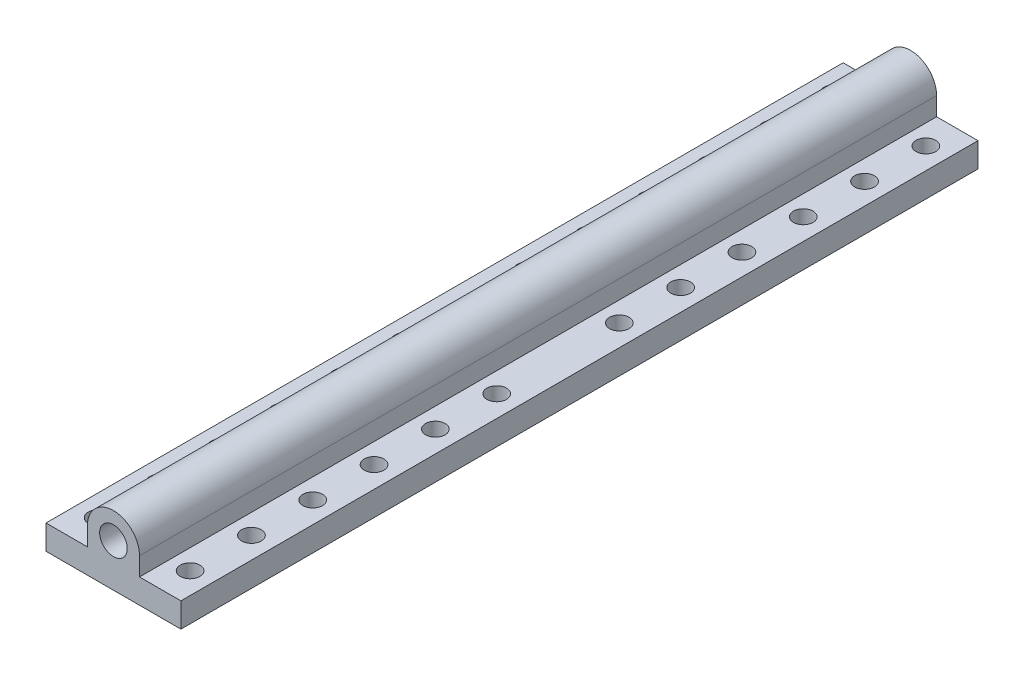
ISO-10303-21;
HEADER;
FILE_DESCRIPTION(('STEP AP214'),'2;1');
FILE_NAME('part.step','',(''),(''),'','','');
FILE_SCHEMA(('AUTOMOTIVE_DESIGN { 1 0 10303 214 1 1 1 1 }'));
ENDSEC;
DATA;
#1=APPLICATION_CONTEXT('core data for automotive mechanical design processes');
#2=APPLICATION_PROTOCOL_DEFINITION('international standard','automotive_design',2000,#1);
#3=PRODUCT_CONTEXT('',#1,'mechanical');
#4=PRODUCT('Part','Part','',(#3));
#5=PRODUCT_RELATED_PRODUCT_CATEGORY('part','',(#4));
#6=PRODUCT_DEFINITION_FORMATION('','',#4);
#7=PRODUCT_DEFINITION_CONTEXT('part definition',#1,'design');
#8=PRODUCT_DEFINITION('design','',#6,#7);
#9=PRODUCT_DEFINITION_SHAPE('','',#8);
#10=(LENGTH_UNIT() NAMED_UNIT(*) SI_UNIT(.MILLI.,.METRE.));
#11=(NAMED_UNIT(*) PLANE_ANGLE_UNIT() SI_UNIT($,.RADIAN.));
#12=(NAMED_UNIT(*) SI_UNIT($,.STERADIAN.) SOLID_ANGLE_UNIT());
#13=UNCERTAINTY_MEASURE_WITH_UNIT(LENGTH_MEASURE(1.E-05),#10,'distance_accuracy_value','');
#14=(GEOMETRIC_REPRESENTATION_CONTEXT(3) GLOBAL_UNCERTAINTY_ASSIGNED_CONTEXT((#13)) GLOBAL_UNIT_ASSIGNED_CONTEXT((#10,
#11,#12)) REPRESENTATION_CONTEXT('',''));
#15=CARTESIAN_POINT('',(0.,0.,0.));
#16=DIRECTION('',(0.,0.,1.));
#17=DIRECTION('',(1.,0.,0.));
#18=AXIS2_PLACEMENT_3D('',#15,#16,#17);
#19=CARTESIAN_POINT('',(1.27227011494252,7.,130.));
#20=DIRECTION('',(0.,0.,1.));
#21=DIRECTION('',(1.,0.,0.));
#22=AXIS2_PLACEMENT_3D('',#19,#20,#21);
#23=PLANE('',#22);
#24=DIRECTION('',(0.,-1.,0.));
#25=VECTOR('',#24,1.);
#26=CARTESIAN_POINT('',(-9.72772988505748,4.,130.));
#27=LINE('',#26,#25);
#28=CARTESIAN_POINT('',(-9.72772988505748,4.,130.));
#29=VERTEX_POINT('',#28);
#30=CARTESIAN_POINT('',(-9.72772988505748,0.,130.));
#31=VERTEX_POINT('',#30);
#32=EDGE_CURVE('E166',#29,#31,#27,.T.);
#33=ORIENTED_EDGE('',*,*,#32,.T.);
#34=DIRECTION('',(1.,0.,0.));
#35=VECTOR('',#34,1.);
#36=CARTESIAN_POINT('',(-9.72772988505748,0.,130.));
#37=LINE('',#36,#35);
#38=CARTESIAN_POINT('',(12.2722701149425,0.,130.));
#39=VERTEX_POINT('',#38);
#40=EDGE_CURVE('E102',#31,#39,#37,.T.);
#41=ORIENTED_EDGE('',*,*,#40,.T.);
#42=DIRECTION('',(0.,1.,0.));
#43=VECTOR('',#42,1.);
#44=CARTESIAN_POINT('',(12.2722701149425,0.,130.));
#45=LINE('',#44,#43);
#46=CARTESIAN_POINT('',(12.2722701149425,4.,130.));
#47=VERTEX_POINT('',#46);
#48=EDGE_CURVE('E325',#39,#47,#45,.T.);
#49=ORIENTED_EDGE('',*,*,#48,.T.);
#50=DIRECTION('',(-1.,0.,0.));
#51=VECTOR('',#50,1.);
#52=CARTESIAN_POINT('',(12.2722701149425,4.,130.));
#53=LINE('',#52,#51);
#54=CARTESIAN_POINT('',(5.52227011494252,4.,130.));
#55=VERTEX_POINT('',#54);
#56=EDGE_CURVE('E328',#47,#55,#53,.T.);
#57=ORIENTED_EDGE('',*,*,#56,.T.);
#58=DIRECTION('',(0.,1.,0.));
#59=VECTOR('',#58,1.);
#60=CARTESIAN_POINT('',(5.52227011494252,7.,130.));
#61=LINE('',#60,#59);
#62=CARTESIAN_POINT('',(5.52227011494252,7.,130.));
#63=VERTEX_POINT('',#62);
#64=EDGE_CURVE('E121',#55,#63,#61,.T.);
#65=ORIENTED_EDGE('',*,*,#64,.T.);
#66=CARTESIAN_POINT('',(1.27227011494252,7.,130.));
#67=DIRECTION('',(0.,0.,1.));
#68=DIRECTION('',(1.,0.,0.));
#69=AXIS2_PLACEMENT_3D('',#66,#67,#68);
#70=CIRCLE('',#69,4.25);
#71=CARTESIAN_POINT('',(-2.97772988505748,6.99999999999997,130.));
#72=VERTEX_POINT('',#71);
#73=EDGE_CURVE('E115',#63,#72,#70,.T.);
#74=ORIENTED_EDGE('',*,*,#73,.T.);
#75=DIRECTION('',(0.,-1.,0.));
#76=VECTOR('',#75,1.);
#77=CARTESIAN_POINT('',(-2.97772988505748,6.99999999999997,130.));
#78=LINE('',#77,#76);
#79=CARTESIAN_POINT('',(-2.97772988505748,4.,130.));
#80=VERTEX_POINT('',#79);
#81=EDGE_CURVE('E119',#72,#80,#78,.T.);
#82=ORIENTED_EDGE('',*,*,#81,.T.);
#83=DIRECTION('',(-1.,0.,0.));
#84=VECTOR('',#83,1.);
#85=CARTESIAN_POINT('',(-2.97772988505748,4.,130.));
#86=LINE('',#85,#84);
#87=EDGE_CURVE('E59',#80,#29,#86,.T.);
#88=ORIENTED_EDGE('',*,*,#87,.T.);
#89=EDGE_LOOP('',(#33,#41,#49,#57,#65,#74,#82,#88));
#90=FACE_BOUND('',#89,.T.);
#91=CARTESIAN_POINT('',(1.27227011494252,7.,130.));
#92=DIRECTION('',(0.,0.,1.));
#93=DIRECTION('',(1.,0.,0.));
#94=AXIS2_PLACEMENT_3D('',#91,#92,#93);
#95=CIRCLE('',#94,2.25);
#96=CARTESIAN_POINT('',(3.52227011494252,7.,130.));
#97=VERTEX_POINT('',#96);
#98=EDGE_CURVE('E148',#97,#97,#95,.T.);
#99=ORIENTED_EDGE('',*,*,#98,.F.);
#100=EDGE_LOOP('',(#99));
#101=FACE_BOUND('',#100,.T.);
#102=ADVANCED_FACE('F39',(#90,#101),#23,.T.);
#103=CARTESIAN_POINT('',(1.27227011494252,7.,0.));
#104=DIRECTION('',(0.,0.,1.));
#105=DIRECTION('',(1.,0.,0.));
#106=AXIS2_PLACEMENT_3D('',#103,#104,#105);
#107=PLANE('',#106);
#108=DIRECTION('',(0.,-1.,0.));
#109=VECTOR('',#108,1.);
#110=CARTESIAN_POINT('',(-9.72772988505748,4.,0.));
#111=LINE('',#110,#109);
#112=CARTESIAN_POINT('',(-9.72772988505748,4.,0.));
#113=VERTEX_POINT('',#112);
#114=CARTESIAN_POINT('',(-9.72772988505748,0.,0.));
#115=VERTEX_POINT('',#114);
#116=EDGE_CURVE('E143',#113,#115,#111,.T.);
#117=ORIENTED_EDGE('',*,*,#116,.F.);
#118=DIRECTION('',(-1.,0.,0.));
#119=VECTOR('',#118,1.);
#120=CARTESIAN_POINT('',(-2.97772988505748,4.,0.));
#121=LINE('',#120,#119);
#122=CARTESIAN_POINT('',(-2.97772988505748,4.,0.));
#123=VERTEX_POINT('',#122);
#124=EDGE_CURVE('E94',#123,#113,#121,.T.);
#125=ORIENTED_EDGE('',*,*,#124,.F.);
#126=DIRECTION('',(0.,-1.,0.));
#127=VECTOR('',#126,1.);
#128=CARTESIAN_POINT('',(-2.97772988505748,6.99999999999997,0.));
#129=LINE('',#128,#127);
#130=CARTESIAN_POINT('',(-2.97772988505748,6.99999999999997,0.));
#131=VERTEX_POINT('',#130);
#132=EDGE_CURVE('E88',#131,#123,#129,.T.);
#133=ORIENTED_EDGE('',*,*,#132,.F.);
#134=CARTESIAN_POINT('',(1.27227011494252,7.,0.));
#135=DIRECTION('',(0.,0.,1.));
#136=DIRECTION('',(1.,0.,0.));
#137=AXIS2_PLACEMENT_3D('',#134,#135,#136);
#138=CIRCLE('',#137,4.25);
#139=CARTESIAN_POINT('',(5.52227011494252,7.,0.));
#140=VERTEX_POINT('',#139);
#141=EDGE_CURVE('E130',#140,#131,#138,.T.);
#142=ORIENTED_EDGE('',*,*,#141,.F.);
#143=DIRECTION('',(0.,1.,0.));
#144=VECTOR('',#143,1.);
#145=CARTESIAN_POINT('',(5.52227011494252,7.,0.));
#146=LINE('',#145,#144);
#147=CARTESIAN_POINT('',(5.52227011494252,4.,0.));
#148=VERTEX_POINT('',#147);
#149=EDGE_CURVE('E157',#148,#140,#146,.T.);
#150=ORIENTED_EDGE('',*,*,#149,.F.);
#151=DIRECTION('',(-1.,0.,0.));
#152=VECTOR('',#151,1.);
#153=CARTESIAN_POINT('',(12.2722701149425,4.,0.));
#154=LINE('',#153,#152);
#155=CARTESIAN_POINT('',(12.2722701149425,4.,0.));
#156=VERTEX_POINT('',#155);
#157=EDGE_CURVE('E154',#156,#148,#154,.T.);
#158=ORIENTED_EDGE('',*,*,#157,.F.);
#159=DIRECTION('',(0.,1.,0.));
#160=VECTOR('',#159,1.);
#161=CARTESIAN_POINT('',(12.2722701149425,0.,0.));
#162=LINE('',#161,#160);
#163=CARTESIAN_POINT('',(12.2722701149425,0.,0.));
#164=VERTEX_POINT('',#163);
#165=EDGE_CURVE('E151',#164,#156,#162,.T.);
#166=ORIENTED_EDGE('',*,*,#165,.F.);
#167=DIRECTION('',(1.,0.,0.));
#168=VECTOR('',#167,1.);
#169=CARTESIAN_POINT('',(-9.72772988505748,0.,0.));
#170=LINE('',#169,#168);
#171=EDGE_CURVE('E147',#115,#164,#170,.T.);
#172=ORIENTED_EDGE('',*,*,#171,.F.);
#173=EDGE_LOOP('',(#117,#125,#133,#142,#150,#158,#166,#172));
#174=FACE_BOUND('',#173,.T.);
#175=CARTESIAN_POINT('',(1.27227011494252,7.,0.));
#176=DIRECTION('',(0.,0.,1.));
#177=DIRECTION('',(1.,0.,0.));
#178=AXIS2_PLACEMENT_3D('',#175,#176,#177);
#179=CIRCLE('',#178,2.25);
#180=CARTESIAN_POINT('',(3.52227011494252,7.,0.));
#181=VERTEX_POINT('',#180);
#182=EDGE_CURVE('E314',#181,#181,#179,.T.);
#183=ORIENTED_EDGE('',*,*,#182,.T.);
#184=EDGE_LOOP('',(#183));
#185=FACE_BOUND('',#184,.T.);
#186=ADVANCED_FACE('F415',(#174,#185),#107,.F.);
#187=CARTESIAN_POINT('',(-9.72772988505748,4.,130.));
#188=DIRECTION('',(1.,0.,0.));
#189=DIRECTION('',(0.,0.,-1.));
#190=AXIS2_PLACEMENT_3D('',#187,#188,#189);
#191=PLANE('',#190);
#192=ORIENTED_EDGE('',*,*,#116,.T.);
#193=DIRECTION('',(0.,0.,-1.));
#194=VECTOR('',#193,1.);
#195=CARTESIAN_POINT('',(-9.72772988505748,0.,130.));
#196=LINE('',#195,#194);
#197=EDGE_CURVE('E11',#31,#115,#196,.T.);
#198=ORIENTED_EDGE('',*,*,#197,.F.);
#199=ORIENTED_EDGE('',*,*,#32,.F.);
#200=DIRECTION('',(0.,0.,-1.));
#201=VECTOR('',#200,1.);
#202=CARTESIAN_POINT('',(-9.72772988505748,4.,130.));
#203=LINE('',#202,#201);
#204=EDGE_CURVE('E139',#29,#113,#203,.T.);
#205=ORIENTED_EDGE('',*,*,#204,.T.);
#206=EDGE_LOOP('',(#192,#198,#199,#205));
#207=FACE_BOUND('',#206,.T.);
#208=ADVANCED_FACE('F41',(#207),#191,.F.);
#209=CARTESIAN_POINT('',(-9.72772988505748,0.,130.));
#210=DIRECTION('',(0.,1.,0.));
#211=DIRECTION('',(0.,0.,1.));
#212=AXIS2_PLACEMENT_3D('',#209,#210,#211);
#213=PLANE('',#212);
#214=CARTESIAN_POINT('',(-6.22772988505748,0.,85.));
#215=DIRECTION('',(0.,1.,0.));
#216=DIRECTION('',(0.,0.,1.));
#217=AXIS2_PLACEMENT_3D('',#214,#215,#216);
#218=CIRCLE('',#217,1.6);
#219=CARTESIAN_POINT('',(-6.22772988505748,0.,86.6));
#220=VERTEX_POINT('',#219);
#221=EDGE_CURVE('E243',#220,#220,#218,.T.);
#222=ORIENTED_EDGE('',*,*,#221,.T.);
#223=EDGE_LOOP('',(#222));
#224=FACE_BOUND('',#223,.T.);
#225=CARTESIAN_POINT('',(-6.22772988505748,0.,105.));
#226=DIRECTION('',(0.,1.,0.));
#227=DIRECTION('',(0.,0.,1.));
#228=AXIS2_PLACEMENT_3D('',#225,#226,#227);
#229=CIRCLE('',#228,1.6);
#230=CARTESIAN_POINT('',(-6.22772988505748,0.,106.6));
#231=VERTEX_POINT('',#230);
#232=EDGE_CURVE('E238',#231,#231,#229,.T.);
#233=ORIENTED_EDGE('',*,*,#232,.T.);
#234=EDGE_LOOP('',(#233));
#235=FACE_BOUND('',#234,.T.);
#236=CARTESIAN_POINT('',(8.77227011494252,0.,55.));
#237=DIRECTION('',(0.,1.,0.));
#238=DIRECTION('',(0.,0.,1.));
#239=AXIS2_PLACEMENT_3D('',#236,#237,#238);
#240=CIRCLE('',#239,1.6);
#241=CARTESIAN_POINT('',(8.77227011494252,0.,56.6));
#242=VERTEX_POINT('',#241);
#243=EDGE_CURVE('E310',#242,#242,#240,.T.);
#244=ORIENTED_EDGE('',*,*,#243,.T.);
#245=EDGE_LOOP('',(#244));
#246=FACE_BOUND('',#245,.T.);
#247=CARTESIAN_POINT('',(-6.22772988505748,0.,55.));
#248=DIRECTION('',(0.,1.,0.));
#249=DIRECTION('',(0.,0.,1.));
#250=AXIS2_PLACEMENT_3D('',#247,#248,#249);
#251=CIRCLE('',#250,1.6);
#252=CARTESIAN_POINT('',(-6.22772988505748,0.,56.6));
#253=VERTEX_POINT('',#252);
#254=EDGE_CURVE('E233',#253,#253,#251,.T.);
#255=ORIENTED_EDGE('',*,*,#254,.T.);
#256=EDGE_LOOP('',(#255));
#257=FACE_BOUND('',#256,.T.);
#258=CARTESIAN_POINT('',(8.77227011494252,0.,25.));
#259=DIRECTION('',(0.,1.,0.));
#260=DIRECTION('',(0.,0.,1.));
#261=AXIS2_PLACEMENT_3D('',#258,#259,#260);
#262=CIRCLE('',#261,1.6);
#263=CARTESIAN_POINT('',(8.77227011494252,0.,26.6));
#264=VERTEX_POINT('',#263);
#265=EDGE_CURVE('E296',#264,#264,#262,.T.);
#266=ORIENTED_EDGE('',*,*,#265,.T.);
#267=EDGE_LOOP('',(#266));
#268=FACE_BOUND('',#267,.T.);
#269=CARTESIAN_POINT('',(-6.22772988505748,0.,25.));
#270=DIRECTION('',(0.,1.,0.));
#271=DIRECTION('',(0.,0.,1.));
#272=AXIS2_PLACEMENT_3D('',#269,#270,#271);
#273=CIRCLE('',#272,1.6);
#274=CARTESIAN_POINT('',(-6.22772988505748,0.,26.6));
#275=VERTEX_POINT('',#274);
#276=EDGE_CURVE('E228',#275,#275,#273,.T.);
#277=ORIENTED_EDGE('',*,*,#276,.T.);
#278=EDGE_LOOP('',(#277));
#279=FACE_BOUND('',#278,.T.);
#280=CARTESIAN_POINT('',(-6.22772988505748,0.,45.));
#281=DIRECTION('',(0.,1.,0.));
#282=DIRECTION('',(0.,0.,1.));
#283=AXIS2_PLACEMENT_3D('',#280,#281,#282);
#284=CIRCLE('',#283,1.6);
#285=CARTESIAN_POINT('',(-6.22772988505748,0.,46.6));
#286=VERTEX_POINT('',#285);
#287=EDGE_CURVE('E223',#286,#286,#284,.T.);
#288=ORIENTED_EDGE('',*,*,#287,.T.);
#289=EDGE_LOOP('',(#288));
#290=FACE_BOUND('',#289,.T.);
#291=CARTESIAN_POINT('',(-6.22772988505748,0.,35.));
#292=DIRECTION('',(0.,1.,0.));
#293=DIRECTION('',(0.,0.,1.));
#294=AXIS2_PLACEMENT_3D('',#291,#292,#293);
#295=CIRCLE('',#294,1.6);
#296=CARTESIAN_POINT('',(-6.22772988505748,0.,36.6));
#297=VERTEX_POINT('',#296);
#298=EDGE_CURVE('E218',#297,#297,#295,.T.);
#299=ORIENTED_EDGE('',*,*,#298,.T.);
#300=EDGE_LOOP('',(#299));
#301=FACE_BOUND('',#300,.T.);
#302=CARTESIAN_POINT('',(-6.22772988505748,0.,5.));
#303=DIRECTION('',(0.,1.,0.));
#304=DIRECTION('',(0.,0.,1.));
#305=AXIS2_PLACEMENT_3D('',#302,#303,#304);
#306=CIRCLE('',#305,1.6);
#307=CARTESIAN_POINT('',(-6.22772988505748,0.,6.6));
#308=VERTEX_POINT('',#307);
#309=EDGE_CURVE('E213',#308,#308,#306,.T.);
#310=ORIENTED_EDGE('',*,*,#309,.T.);
#311=EDGE_LOOP('',(#310));
#312=FACE_BOUND('',#311,.T.);
#313=CARTESIAN_POINT('',(8.77227011494252,0.,105.));
#314=DIRECTION('',(0.,1.,0.));
#315=DIRECTION('',(0.,0.,1.));
#316=AXIS2_PLACEMENT_3D('',#313,#314,#315);
#317=CIRCLE('',#316,1.6);
#318=CARTESIAN_POINT('',(8.77227011494252,0.,106.6));
#319=VERTEX_POINT('',#318);
#320=EDGE_CURVE('E292',#319,#319,#317,.T.);
#321=ORIENTED_EDGE('',*,*,#320,.T.);
#322=EDGE_LOOP('',(#321));
#323=FACE_BOUND('',#322,.T.);
#324=CARTESIAN_POINT('',(8.77227011494252,0.,4.99999999999999));
#325=DIRECTION('',(0.,1.,0.));
#326=DIRECTION('',(0.,0.,1.));
#327=AXIS2_PLACEMENT_3D('',#324,#325,#326);
#328=CIRCLE('',#327,1.6);
#329=CARTESIAN_POINT('',(8.77227011494252,0.,6.6));
#330=VERTEX_POINT('',#329);
#331=EDGE_CURVE('E288',#330,#330,#328,.T.);
#332=ORIENTED_EDGE('',*,*,#331,.T.);
#333=EDGE_LOOP('',(#332));
#334=FACE_BOUND('',#333,.T.);
#335=CARTESIAN_POINT('',(-6.22772988505748,0.,75.));
#336=DIRECTION('',(0.,1.,0.));
#337=DIRECTION('',(0.,0.,1.));
#338=AXIS2_PLACEMENT_3D('',#335,#336,#337);
#339=CIRCLE('',#338,1.6);
#340=CARTESIAN_POINT('',(-6.22772988505748,0.,76.6));
#341=VERTEX_POINT('',#340);
#342=EDGE_CURVE('E208',#341,#341,#339,.T.);
#343=ORIENTED_EDGE('',*,*,#342,.T.);
#344=EDGE_LOOP('',(#343));
#345=FACE_BOUND('',#344,.T.);
#346=CARTESIAN_POINT('',(-6.22772988505748,0.,15.));
#347=DIRECTION('',(0.,1.,0.));
#348=DIRECTION('',(0.,0.,1.));
#349=AXIS2_PLACEMENT_3D('',#346,#347,#348);
#350=CIRCLE('',#349,1.6);
#351=CARTESIAN_POINT('',(-6.22772988505748,0.,16.6));
#352=VERTEX_POINT('',#351);
#353=EDGE_CURVE('E203',#352,#352,#350,.T.);
#354=ORIENTED_EDGE('',*,*,#353,.T.);
#355=EDGE_LOOP('',(#354));
#356=FACE_BOUND('',#355,.T.);
#357=CARTESIAN_POINT('',(8.77227011494252,0.,15.));
#358=DIRECTION('',(0.,1.,0.));
#359=DIRECTION('',(0.,0.,1.));
#360=AXIS2_PLACEMENT_3D('',#357,#358,#359);
#361=CIRCLE('',#360,1.6);
#362=CARTESIAN_POINT('',(8.77227011494252,0.,16.6));
#363=VERTEX_POINT('',#362);
#364=EDGE_CURVE('E283',#363,#363,#361,.T.);
#365=ORIENTED_EDGE('',*,*,#364,.T.);
#366=EDGE_LOOP('',(#365));
#367=FACE_BOUND('',#366,.T.);
#368=CARTESIAN_POINT('',(8.77227011494252,0.,35.));
#369=DIRECTION('',(0.,1.,0.));
#370=DIRECTION('',(0.,0.,1.));
#371=AXIS2_PLACEMENT_3D('',#368,#369,#370);
#372=CIRCLE('',#371,1.6);
#373=CARTESIAN_POINT('',(8.77227011494252,0.,36.6));
#374=VERTEX_POINT('',#373);
#375=EDGE_CURVE('E278',#374,#374,#372,.T.);
#376=ORIENTED_EDGE('',*,*,#375,.T.);
#377=EDGE_LOOP('',(#376));
#378=FACE_BOUND('',#377,.T.);
#379=CARTESIAN_POINT('',(8.77227011494252,0.,45.));
#380=DIRECTION('',(0.,1.,0.));
#381=DIRECTION('',(0.,0.,1.));
#382=AXIS2_PLACEMENT_3D('',#379,#380,#381);
#383=CIRCLE('',#382,1.6);
#384=CARTESIAN_POINT('',(8.77227011494252,0.,46.6));
#385=VERTEX_POINT('',#384);
#386=EDGE_CURVE('E273',#385,#385,#383,.T.);
#387=ORIENTED_EDGE('',*,*,#386,.T.);
#388=EDGE_LOOP('',(#387));
#389=FACE_BOUND('',#388,.T.);
#390=CARTESIAN_POINT('',(8.77227011494252,0.,125.));
#391=DIRECTION('',(0.,1.,0.));
#392=DIRECTION('',(0.,0.,1.));
#393=AXIS2_PLACEMENT_3D('',#390,#391,#392);
#394=CIRCLE('',#393,1.6);
#395=CARTESIAN_POINT('',(8.77227011494252,0.,126.6));
#396=VERTEX_POINT('',#395);
#397=EDGE_CURVE('E268',#396,#396,#394,.T.);
#398=ORIENTED_EDGE('',*,*,#397,.T.);
#399=EDGE_LOOP('',(#398));
#400=FACE_BOUND('',#399,.T.);
#401=CARTESIAN_POINT('',(-6.22772988505748,0.,125.));
#402=DIRECTION('',(0.,1.,0.));
#403=DIRECTION('',(0.,0.,1.));
#404=AXIS2_PLACEMENT_3D('',#401,#402,#403);
#405=CIRCLE('',#404,1.6);
#406=CARTESIAN_POINT('',(-6.22772988505748,0.,126.6));
#407=VERTEX_POINT('',#406);
#408=EDGE_CURVE('E198',#407,#407,#405,.T.);
#409=ORIENTED_EDGE('',*,*,#408,.T.);
#410=EDGE_LOOP('',(#409));
#411=FACE_BOUND('',#410,.T.);
#412=CARTESIAN_POINT('',(-6.22772988505748,0.,115.));
#413=DIRECTION('',(0.,1.,0.));
#414=DIRECTION('',(0.,0.,1.));
#415=AXIS2_PLACEMENT_3D('',#412,#413,#414);
#416=CIRCLE('',#415,1.6);
#417=CARTESIAN_POINT('',(-6.22772988505748,0.,116.6));
#418=VERTEX_POINT('',#417);
#419=EDGE_CURVE('E193',#418,#418,#416,.T.);
#420=ORIENTED_EDGE('',*,*,#419,.T.);
#421=EDGE_LOOP('',(#420));
#422=FACE_BOUND('',#421,.T.);
#423=CARTESIAN_POINT('',(-6.22772988505748,0.,95.));
#424=DIRECTION('',(0.,1.,0.));
#425=DIRECTION('',(0.,0.,1.));
#426=AXIS2_PLACEMENT_3D('',#423,#424,#425);
#427=CIRCLE('',#426,1.6);
#428=CARTESIAN_POINT('',(-6.22772988505748,0.,96.6));
#429=VERTEX_POINT('',#428);
#430=EDGE_CURVE('E188',#429,#429,#427,.T.);
#431=ORIENTED_EDGE('',*,*,#430,.T.);
#432=EDGE_LOOP('',(#431));
#433=FACE_BOUND('',#432,.T.);
#434=CARTESIAN_POINT('',(8.77227011494252,0.,85.));
#435=DIRECTION('',(0.,1.,0.));
#436=DIRECTION('',(0.,0.,1.));
#437=AXIS2_PLACEMENT_3D('',#434,#435,#436);
#438=CIRCLE('',#437,1.6);
#439=CARTESIAN_POINT('',(8.77227011494252,0.,86.6));
#440=VERTEX_POINT('',#439);
#441=EDGE_CURVE('E263',#440,#440,#438,.T.);
#442=ORIENTED_EDGE('',*,*,#441,.T.);
#443=EDGE_LOOP('',(#442));
#444=FACE_BOUND('',#443,.T.);
#445=CARTESIAN_POINT('',(8.77227011494252,0.,95.));
#446=DIRECTION('',(0.,1.,0.));
#447=DIRECTION('',(0.,0.,1.));
#448=AXIS2_PLACEMENT_3D('',#445,#446,#447);
#449=CIRCLE('',#448,1.6);
#450=CARTESIAN_POINT('',(8.77227011494252,0.,96.6));
#451=VERTEX_POINT('',#450);
#452=EDGE_CURVE('E258',#451,#451,#449,.T.);
#453=ORIENTED_EDGE('',*,*,#452,.T.);
#454=EDGE_LOOP('',(#453));
#455=FACE_BOUND('',#454,.T.);
#456=CARTESIAN_POINT('',(8.77227011494252,0.,115.));
#457=DIRECTION('',(0.,1.,0.));
#458=DIRECTION('',(0.,0.,1.));
#459=AXIS2_PLACEMENT_3D('',#456,#457,#458);
#460=CIRCLE('',#459,1.6);
#461=CARTESIAN_POINT('',(8.77227011494252,0.,116.6));
#462=VERTEX_POINT('',#461);
#463=EDGE_CURVE('E253',#462,#462,#460,.T.);
#464=ORIENTED_EDGE('',*,*,#463,.T.);
#465=EDGE_LOOP('',(#464));
#466=FACE_BOUND('',#465,.T.);
#467=CARTESIAN_POINT('',(8.77227011494252,0.,75.));
#468=DIRECTION('',(0.,1.,0.));
#469=DIRECTION('',(0.,0.,1.));
#470=AXIS2_PLACEMENT_3D('',#467,#468,#469);
#471=CIRCLE('',#470,1.6);
#472=CARTESIAN_POINT('',(8.77227011494252,0.,76.6));
#473=VERTEX_POINT('',#472);
#474=EDGE_CURVE('E248',#473,#473,#471,.T.);
#475=ORIENTED_EDGE('',*,*,#474,.T.);
#476=EDGE_LOOP('',(#475));
#477=FACE_BOUND('',#476,.T.);
#478=ORIENTED_EDGE('',*,*,#171,.T.);
#479=DIRECTION('',(0.,0.,-1.));
#480=VECTOR('',#479,1.);
#481=CARTESIAN_POINT('',(12.2722701149425,0.,130.));
#482=LINE('',#481,#480);
#483=EDGE_CURVE('E50',#39,#164,#482,.T.);
#484=ORIENTED_EDGE('',*,*,#483,.F.);
#485=ORIENTED_EDGE('',*,*,#40,.F.);
#486=ORIENTED_EDGE('',*,*,#197,.T.);
#487=EDGE_LOOP('',(#478,#484,#485,#486));
#488=FACE_BOUND('',#487,.T.);
#489=ADVANCED_FACE('F344',(#224,#235,#246,#257,#268,#279,#290,#301,#312,#323,#334,#345,#356,
#367,#378,#389,#400,#411,#422,#433,#444,#455,#466,#477,#488),#213,.F.);
#490=CARTESIAN_POINT('',(12.2722701149425,0.,130.));
#491=DIRECTION('',(-1.,0.,0.));
#492=DIRECTION('',(0.,0.,1.));
#493=AXIS2_PLACEMENT_3D('',#490,#491,#492);
#494=PLANE('',#493);
#495=ORIENTED_EDGE('',*,*,#165,.T.);
#496=DIRECTION('',(0.,0.,-1.));
#497=VECTOR('',#496,1.);
#498=CARTESIAN_POINT('',(12.2722701149425,4.,130.));
#499=LINE('',#498,#497);
#500=EDGE_CURVE('E177',#47,#156,#499,.T.);
#501=ORIENTED_EDGE('',*,*,#500,.F.);
#502=ORIENTED_EDGE('',*,*,#48,.F.);
#503=ORIENTED_EDGE('',*,*,#483,.T.);
#504=EDGE_LOOP('',(#495,#501,#502,#503));
#505=FACE_BOUND('',#504,.T.);
#506=ADVANCED_FACE('F347',(#505),#494,.F.);
#507=CARTESIAN_POINT('',(12.2722701149425,4.,130.));
#508=DIRECTION('',(0.,-1.,0.));
#509=DIRECTION('',(1.,0.,0.));
#510=AXIS2_PLACEMENT_3D('',#507,#508,#509);
#511=PLANE('',#510);
#512=CARTESIAN_POINT('',(8.77227011494252,4.,55.));
#513=DIRECTION('',(0.,-1.,0.));
#514=DIRECTION('',(1.,0.,0.));
#515=AXIS2_PLACEMENT_3D('',#512,#513,#514);
#516=CIRCLE('',#515,1.6);
#517=CARTESIAN_POINT('',(10.3722701149425,4.,55.));
#518=VERTEX_POINT('',#517);
#519=EDGE_CURVE('E43',#518,#518,#516,.T.);
#520=ORIENTED_EDGE('',*,*,#519,.T.);
#521=EDGE_LOOP('',(#520));
#522=FACE_BOUND('',#521,.T.);
#523=CARTESIAN_POINT('',(8.77227011494252,4.,25.));
#524=DIRECTION('',(0.,-1.,0.));
#525=DIRECTION('',(1.,0.,0.));
#526=AXIS2_PLACEMENT_3D('',#523,#524,#525);
#527=CIRCLE('',#526,1.6);
#528=CARTESIAN_POINT('',(10.3722701149425,4.,25.));
#529=VERTEX_POINT('',#528);
#530=EDGE_CURVE('E293',#529,#529,#527,.T.);
#531=ORIENTED_EDGE('',*,*,#530,.T.);
#532=EDGE_LOOP('',(#531));
#533=FACE_BOUND('',#532,.T.);
#534=CARTESIAN_POINT('',(8.77227011494252,4.,105.));
#535=DIRECTION('',(0.,-1.,0.));
#536=DIRECTION('',(1.,0.,0.));
#537=AXIS2_PLACEMENT_3D('',#534,#535,#536);
#538=CIRCLE('',#537,1.6);
#539=CARTESIAN_POINT('',(10.3722701149425,4.,105.));
#540=VERTEX_POINT('',#539);
#541=EDGE_CURVE('E289',#540,#540,#538,.T.);
#542=ORIENTED_EDGE('',*,*,#541,.T.);
#543=EDGE_LOOP('',(#542));
#544=FACE_BOUND('',#543,.T.);
#545=CARTESIAN_POINT('',(8.77227011494252,4.,4.99999999999999));
#546=DIRECTION('',(0.,-1.,0.));
#547=DIRECTION('',(1.,0.,0.));
#548=AXIS2_PLACEMENT_3D('',#545,#546,#547);
#549=CIRCLE('',#548,1.6);
#550=CARTESIAN_POINT('',(10.3722701149425,4.,4.99999999999999));
#551=VERTEX_POINT('',#550);
#552=EDGE_CURVE('E284',#551,#551,#549,.T.);
#553=ORIENTED_EDGE('',*,*,#552,.T.);
#554=EDGE_LOOP('',(#553));
#555=FACE_BOUND('',#554,.T.);
#556=CARTESIAN_POINT('',(8.77227011494252,4.,15.));
#557=DIRECTION('',(0.,-1.,0.));
#558=DIRECTION('',(1.,0.,0.));
#559=AXIS2_PLACEMENT_3D('',#556,#557,#558);
#560=CIRCLE('',#559,1.6);
#561=CARTESIAN_POINT('',(10.3722701149425,4.,15.));
#562=VERTEX_POINT('',#561);
#563=EDGE_CURVE('E279',#562,#562,#560,.T.);
#564=ORIENTED_EDGE('',*,*,#563,.T.);
#565=EDGE_LOOP('',(#564));
#566=FACE_BOUND('',#565,.T.);
#567=CARTESIAN_POINT('',(8.77227011494252,4.,35.));
#568=DIRECTION('',(0.,-1.,0.));
#569=DIRECTION('',(1.,0.,0.));
#570=AXIS2_PLACEMENT_3D('',#567,#568,#569);
#571=CIRCLE('',#570,1.6);
#572=CARTESIAN_POINT('',(10.3722701149425,4.,35.));
#573=VERTEX_POINT('',#572);
#574=EDGE_CURVE('E274',#573,#573,#571,.T.);
#575=ORIENTED_EDGE('',*,*,#574,.T.);
#576=EDGE_LOOP('',(#575));
#577=FACE_BOUND('',#576,.T.);
#578=CARTESIAN_POINT('',(8.77227011494252,4.,45.));
#579=DIRECTION('',(0.,-1.,0.));
#580=DIRECTION('',(1.,0.,0.));
#581=AXIS2_PLACEMENT_3D('',#578,#579,#580);
#582=CIRCLE('',#581,1.6);
#583=CARTESIAN_POINT('',(10.3722701149425,4.,45.));
#584=VERTEX_POINT('',#583);
#585=EDGE_CURVE('E269',#584,#584,#582,.T.);
#586=ORIENTED_EDGE('',*,*,#585,.T.);
#587=EDGE_LOOP('',(#586));
#588=FACE_BOUND('',#587,.T.);
#589=CARTESIAN_POINT('',(8.77227011494252,4.,125.));
#590=DIRECTION('',(0.,-1.,0.));
#591=DIRECTION('',(1.,0.,0.));
#592=AXIS2_PLACEMENT_3D('',#589,#590,#591);
#593=CIRCLE('',#592,1.6);
#594=CARTESIAN_POINT('',(10.3722701149425,4.,125.));
#595=VERTEX_POINT('',#594);
#596=EDGE_CURVE('E264',#595,#595,#593,.T.);
#597=ORIENTED_EDGE('',*,*,#596,.T.);
#598=EDGE_LOOP('',(#597));
#599=FACE_BOUND('',#598,.T.);
#600=CARTESIAN_POINT('',(8.77227011494252,4.,85.));
#601=DIRECTION('',(0.,-1.,0.));
#602=DIRECTION('',(1.,0.,0.));
#603=AXIS2_PLACEMENT_3D('',#600,#601,#602);
#604=CIRCLE('',#603,1.6);
#605=CARTESIAN_POINT('',(10.3722701149425,4.,85.));
#606=VERTEX_POINT('',#605);
#607=EDGE_CURVE('E259',#606,#606,#604,.T.);
#608=ORIENTED_EDGE('',*,*,#607,.T.);
#609=EDGE_LOOP('',(#608));
#610=FACE_BOUND('',#609,.T.);
#611=CARTESIAN_POINT('',(8.77227011494252,4.,95.));
#612=DIRECTION('',(0.,-1.,0.));
#613=DIRECTION('',(1.,0.,0.));
#614=AXIS2_PLACEMENT_3D('',#611,#612,#613);
#615=CIRCLE('',#614,1.6);
#616=CARTESIAN_POINT('',(10.3722701149425,4.,95.));
#617=VERTEX_POINT('',#616);
#618=EDGE_CURVE('E254',#617,#617,#615,.T.);
#619=ORIENTED_EDGE('',*,*,#618,.T.);
#620=EDGE_LOOP('',(#619));
#621=FACE_BOUND('',#620,.T.);
#622=CARTESIAN_POINT('',(8.77227011494252,4.,115.));
#623=DIRECTION('',(0.,-1.,0.));
#624=DIRECTION('',(1.,0.,0.));
#625=AXIS2_PLACEMENT_3D('',#622,#623,#624);
#626=CIRCLE('',#625,1.6);
#627=CARTESIAN_POINT('',(10.3722701149425,4.,115.));
#628=VERTEX_POINT('',#627);
#629=EDGE_CURVE('E249',#628,#628,#626,.T.);
#630=ORIENTED_EDGE('',*,*,#629,.T.);
#631=EDGE_LOOP('',(#630));
#632=FACE_BOUND('',#631,.T.);
#633=CARTESIAN_POINT('',(8.77227011494252,4.,75.));
#634=DIRECTION('',(0.,-1.,0.));
#635=DIRECTION('',(1.,0.,0.));
#636=AXIS2_PLACEMENT_3D('',#633,#634,#635);
#637=CIRCLE('',#636,1.6);
#638=CARTESIAN_POINT('',(10.3722701149425,4.,75.));
#639=VERTEX_POINT('',#638);
#640=EDGE_CURVE('E244',#639,#639,#637,.T.);
#641=ORIENTED_EDGE('',*,*,#640,.T.);
#642=EDGE_LOOP('',(#641));
#643=FACE_BOUND('',#642,.T.);
#644=ORIENTED_EDGE('',*,*,#157,.T.);
#645=DIRECTION('',(0.,0.,-1.));
#646=VECTOR('',#645,1.);
#647=CARTESIAN_POINT('',(5.52227011494252,4.,130.));
#648=LINE('',#647,#646);
#649=EDGE_CURVE('E173',#55,#148,#648,.T.);
#650=ORIENTED_EDGE('',*,*,#649,.F.);
#651=ORIENTED_EDGE('',*,*,#56,.F.);
#652=ORIENTED_EDGE('',*,*,#500,.T.);
#653=EDGE_LOOP('',(#644,#650,#651,#652));
#654=FACE_BOUND('',#653,.T.);
#655=ADVANCED_FACE('F335',(#522,#533,#544,#555,#566,#577,#588,#599,#610,#621,#632,#643,#654),
#511,.F.);
#656=CARTESIAN_POINT('',(5.52227011494252,7.,130.));
#657=DIRECTION('',(-1.,0.,0.));
#658=DIRECTION('',(0.,0.,1.));
#659=AXIS2_PLACEMENT_3D('',#656,#657,#658);
#660=PLANE('',#659);
#661=ORIENTED_EDGE('',*,*,#149,.T.);
#662=DIRECTION('',(0.,0.,-1.));
#663=VECTOR('',#662,1.);
#664=CARTESIAN_POINT('',(5.52227011494252,7.,130.));
#665=LINE('',#664,#663);
#666=EDGE_CURVE('E132',#63,#140,#665,.T.);
#667=ORIENTED_EDGE('',*,*,#666,.F.);
#668=ORIENTED_EDGE('',*,*,#64,.F.);
#669=ORIENTED_EDGE('',*,*,#649,.T.);
#670=EDGE_LOOP('',(#661,#667,#668,#669));
#671=FACE_BOUND('',#670,.T.);
#672=ADVANCED_FACE('F422',(#671),#660,.F.);
#673=CARTESIAN_POINT('',(1.27227011494252,7.,130.));
#674=DIRECTION('',(0.,0.,-1.));
#675=DIRECTION('',(-1.,0.,0.));
#676=AXIS2_PLACEMENT_3D('',#673,#674,#675);
#677=CYLINDRICAL_SURFACE('',#676,4.25);
#678=ORIENTED_EDGE('',*,*,#141,.T.);
#679=DIRECTION('',(0.,0.,-1.));
#680=VECTOR('',#679,1.);
#681=CARTESIAN_POINT('',(-2.97772988505748,6.99999999999997,130.));
#682=LINE('',#681,#680);
#683=EDGE_CURVE('E127',#72,#131,#682,.T.);
#684=ORIENTED_EDGE('',*,*,#683,.F.);
#685=ORIENTED_EDGE('',*,*,#73,.F.);
#686=ORIENTED_EDGE('',*,*,#666,.T.);
#687=EDGE_LOOP('',(#678,#684,#685,#686));
#688=FACE_BOUND('',#687,.T.);
#689=ADVANCED_FACE('F128',(#688),#677,.T.);
#690=CARTESIAN_POINT('',(-2.97772988505748,6.99999999999997,130.));
#691=DIRECTION('',(1.,0.,0.));
#692=DIRECTION('',(0.,0.,-1.));
#693=AXIS2_PLACEMENT_3D('',#690,#691,#692);
#694=PLANE('',#693);
#695=ORIENTED_EDGE('',*,*,#132,.T.);
#696=DIRECTION('',(0.,0.,-1.));
#697=VECTOR('',#696,1.);
#698=CARTESIAN_POINT('',(-2.97772988505748,4.,130.));
#699=LINE('',#698,#697);
#700=EDGE_CURVE('E133',#80,#123,#699,.T.);
#701=ORIENTED_EDGE('',*,*,#700,.F.);
#702=ORIENTED_EDGE('',*,*,#81,.F.);
#703=ORIENTED_EDGE('',*,*,#683,.T.);
#704=EDGE_LOOP('',(#695,#701,#702,#703));
#705=FACE_BOUND('',#704,.T.);
#706=ADVANCED_FACE('F135',(#705),#694,.F.);
#707=CARTESIAN_POINT('',(-2.97772988505748,4.,130.));
#708=DIRECTION('',(0.,-1.,0.));
#709=DIRECTION('',(1.,0.,0.));
#710=AXIS2_PLACEMENT_3D('',#707,#708,#709);
#711=PLANE('',#710);
#712=CARTESIAN_POINT('',(-6.22772988505748,4.,85.));
#713=DIRECTION('',(0.,-1.,0.));
#714=DIRECTION('',(1.,0.,0.));
#715=AXIS2_PLACEMENT_3D('',#712,#713,#714);
#716=CIRCLE('',#715,1.6);
#717=CARTESIAN_POINT('',(-4.62772988505748,4.,85.));
#718=VERTEX_POINT('',#717);
#719=EDGE_CURVE('E239',#718,#718,#716,.T.);
#720=ORIENTED_EDGE('',*,*,#719,.T.);
#721=EDGE_LOOP('',(#720));
#722=FACE_BOUND('',#721,.T.);
#723=CARTESIAN_POINT('',(-6.22772988505748,4.,105.));
#724=DIRECTION('',(0.,-1.,0.));
#725=DIRECTION('',(1.,0.,0.));
#726=AXIS2_PLACEMENT_3D('',#723,#724,#725);
#727=CIRCLE('',#726,1.6);
#728=CARTESIAN_POINT('',(-4.62772988505748,4.,105.));
#729=VERTEX_POINT('',#728);
#730=EDGE_CURVE('E234',#729,#729,#727,.T.);
#731=ORIENTED_EDGE('',*,*,#730,.T.);
#732=EDGE_LOOP('',(#731));
#733=FACE_BOUND('',#732,.T.);
#734=CARTESIAN_POINT('',(-6.22772988505748,4.,55.));
#735=DIRECTION('',(0.,-1.,0.));
#736=DIRECTION('',(1.,0.,0.));
#737=AXIS2_PLACEMENT_3D('',#734,#735,#736);
#738=CIRCLE('',#737,1.6);
#739=CARTESIAN_POINT('',(-4.62772988505748,4.,55.));
#740=VERTEX_POINT('',#739);
#741=EDGE_CURVE('E229',#740,#740,#738,.T.);
#742=ORIENTED_EDGE('',*,*,#741,.T.);
#743=EDGE_LOOP('',(#742));
#744=FACE_BOUND('',#743,.T.);
#745=CARTESIAN_POINT('',(-6.22772988505748,4.,25.));
#746=DIRECTION('',(0.,-1.,0.));
#747=DIRECTION('',(1.,0.,0.));
#748=AXIS2_PLACEMENT_3D('',#745,#746,#747);
#749=CIRCLE('',#748,1.6);
#750=CARTESIAN_POINT('',(-4.62772988505748,4.,25.));
#751=VERTEX_POINT('',#750);
#752=EDGE_CURVE('E224',#751,#751,#749,.T.);
#753=ORIENTED_EDGE('',*,*,#752,.T.);
#754=EDGE_LOOP('',(#753));
#755=FACE_BOUND('',#754,.T.);
#756=CARTESIAN_POINT('',(-6.22772988505748,4.,45.));
#757=DIRECTION('',(0.,-1.,0.));
#758=DIRECTION('',(1.,0.,0.));
#759=AXIS2_PLACEMENT_3D('',#756,#757,#758);
#760=CIRCLE('',#759,1.6);
#761=CARTESIAN_POINT('',(-4.62772988505748,4.,45.));
#762=VERTEX_POINT('',#761);
#763=EDGE_CURVE('E219',#762,#762,#760,.T.);
#764=ORIENTED_EDGE('',*,*,#763,.T.);
#765=EDGE_LOOP('',(#764));
#766=FACE_BOUND('',#765,.T.);
#767=CARTESIAN_POINT('',(-6.22772988505748,4.,35.));
#768=DIRECTION('',(0.,-1.,0.));
#769=DIRECTION('',(1.,0.,0.));
#770=AXIS2_PLACEMENT_3D('',#767,#768,#769);
#771=CIRCLE('',#770,1.6);
#772=CARTESIAN_POINT('',(-4.62772988505748,4.,35.));
#773=VERTEX_POINT('',#772);
#774=EDGE_CURVE('E214',#773,#773,#771,.T.);
#775=ORIENTED_EDGE('',*,*,#774,.T.);
#776=EDGE_LOOP('',(#775));
#777=FACE_BOUND('',#776,.T.);
#778=CARTESIAN_POINT('',(-6.22772988505748,4.,5.));
#779=DIRECTION('',(0.,-1.,0.));
#780=DIRECTION('',(1.,0.,0.));
#781=AXIS2_PLACEMENT_3D('',#778,#779,#780);
#782=CIRCLE('',#781,1.6);
#783=CARTESIAN_POINT('',(-4.62772988505748,4.,5.));
#784=VERTEX_POINT('',#783);
#785=EDGE_CURVE('E209',#784,#784,#782,.T.);
#786=ORIENTED_EDGE('',*,*,#785,.T.);
#787=EDGE_LOOP('',(#786));
#788=FACE_BOUND('',#787,.T.);
#789=CARTESIAN_POINT('',(-6.22772988505748,4.,75.));
#790=DIRECTION('',(0.,-1.,0.));
#791=DIRECTION('',(1.,0.,0.));
#792=AXIS2_PLACEMENT_3D('',#789,#790,#791);
#793=CIRCLE('',#792,1.6);
#794=CARTESIAN_POINT('',(-4.62772988505748,4.,75.));
#795=VERTEX_POINT('',#794);
#796=EDGE_CURVE('E204',#795,#795,#793,.T.);
#797=ORIENTED_EDGE('',*,*,#796,.T.);
#798=EDGE_LOOP('',(#797));
#799=FACE_BOUND('',#798,.T.);
#800=CARTESIAN_POINT('',(-6.22772988505748,4.,15.));
#801=DIRECTION('',(0.,-1.,0.));
#802=DIRECTION('',(1.,0.,0.));
#803=AXIS2_PLACEMENT_3D('',#800,#801,#802);
#804=CIRCLE('',#803,1.6);
#805=CARTESIAN_POINT('',(-4.62772988505748,4.,15.));
#806=VERTEX_POINT('',#805);
#807=EDGE_CURVE('E199',#806,#806,#804,.T.);
#808=ORIENTED_EDGE('',*,*,#807,.T.);
#809=EDGE_LOOP('',(#808));
#810=FACE_BOUND('',#809,.T.);
#811=CARTESIAN_POINT('',(-6.22772988505748,4.,125.));
#812=DIRECTION('',(0.,-1.,0.));
#813=DIRECTION('',(1.,0.,0.));
#814=AXIS2_PLACEMENT_3D('',#811,#812,#813);
#815=CIRCLE('',#814,1.6);
#816=CARTESIAN_POINT('',(-4.62772988505748,4.,125.));
#817=VERTEX_POINT('',#816);
#818=EDGE_CURVE('E194',#817,#817,#815,.T.);
#819=ORIENTED_EDGE('',*,*,#818,.T.);
#820=EDGE_LOOP('',(#819));
#821=FACE_BOUND('',#820,.T.);
#822=CARTESIAN_POINT('',(-6.22772988505748,4.,115.));
#823=DIRECTION('',(0.,-1.,0.));
#824=DIRECTION('',(1.,0.,0.));
#825=AXIS2_PLACEMENT_3D('',#822,#823,#824);
#826=CIRCLE('',#825,1.6);
#827=CARTESIAN_POINT('',(-4.62772988505748,4.,115.));
#828=VERTEX_POINT('',#827);
#829=EDGE_CURVE('E189',#828,#828,#826,.T.);
#830=ORIENTED_EDGE('',*,*,#829,.T.);
#831=EDGE_LOOP('',(#830));
#832=FACE_BOUND('',#831,.T.);
#833=CARTESIAN_POINT('',(-6.22772988505748,4.,95.));
#834=DIRECTION('',(0.,-1.,0.));
#835=DIRECTION('',(1.,0.,0.));
#836=AXIS2_PLACEMENT_3D('',#833,#834,#835);
#837=CIRCLE('',#836,1.6);
#838=CARTESIAN_POINT('',(-4.62772988505748,4.,95.));
#839=VERTEX_POINT('',#838);
#840=EDGE_CURVE('E184',#839,#839,#837,.T.);
#841=ORIENTED_EDGE('',*,*,#840,.T.);
#842=EDGE_LOOP('',(#841));
#843=FACE_BOUND('',#842,.T.);
#844=ORIENTED_EDGE('',*,*,#124,.T.);
#845=ORIENTED_EDGE('',*,*,#204,.F.);
#846=ORIENTED_EDGE('',*,*,#87,.F.);
#847=ORIENTED_EDGE('',*,*,#700,.T.);
#848=EDGE_LOOP('',(#844,#845,#846,#847));
#849=FACE_BOUND('',#848,.T.);
#850=ADVANCED_FACE('F425',(#722,#733,#744,#755,#766,#777,#788,#799,#810,#821,#832,#843,#849),
#711,.F.);
#851=CARTESIAN_POINT('',(1.27227011494252,7.,130.));
#852=DIRECTION('',(0.,0.,-1.));
#853=DIRECTION('',(-1.,0.,0.));
#854=AXIS2_PLACEMENT_3D('',#851,#852,#853);
#855=CYLINDRICAL_SURFACE('',#854,2.25);
#856=ORIENTED_EDGE('',*,*,#98,.T.);
#857=EDGE_LOOP('',(#856));
#858=FACE_BOUND('',#857,.T.);
#859=ORIENTED_EDGE('',*,*,#182,.F.);
#860=EDGE_LOOP('',(#859));
#861=FACE_BOUND('',#860,.T.);
#862=ADVANCED_FACE('F427',(#858,#861),#855,.F.);
#863=CARTESIAN_POINT('',(-6.22772988505748,-11.9148517191547,95.));
#864=DIRECTION('',(0.,1.,0.));
#865=DIRECTION('',(0.,0.,1.));
#866=AXIS2_PLACEMENT_3D('',#863,#864,#865);
#867=CYLINDRICAL_SURFACE('',#866,1.6);
#868=ORIENTED_EDGE('',*,*,#840,.F.);
#869=EDGE_LOOP('',(#868));
#870=FACE_BOUND('',#869,.T.);
#871=ORIENTED_EDGE('',*,*,#430,.F.);
#872=EDGE_LOOP('',(#871));
#873=FACE_BOUND('',#872,.T.);
#874=ADVANCED_FACE('F434',(#870,#873),#867,.F.);
#875=CARTESIAN_POINT('',(-6.22772988505748,-11.9148517191547,115.));
#876=DIRECTION('',(0.,1.,0.));
#877=DIRECTION('',(0.,0.,1.));
#878=AXIS2_PLACEMENT_3D('',#875,#876,#877);
#879=CYLINDRICAL_SURFACE('',#878,1.6);
#880=ORIENTED_EDGE('',*,*,#829,.F.);
#881=EDGE_LOOP('',(#880));
#882=FACE_BOUND('',#881,.T.);
#883=ORIENTED_EDGE('',*,*,#419,.F.);
#884=EDGE_LOOP('',(#883));
#885=FACE_BOUND('',#884,.T.);
#886=ADVANCED_FACE('F519',(#882,#885),#879,.F.);
#887=CARTESIAN_POINT('',(-6.22772988505748,-11.9148517191547,125.));
#888=DIRECTION('',(0.,1.,0.));
#889=DIRECTION('',(0.,0.,1.));
#890=AXIS2_PLACEMENT_3D('',#887,#888,#889);
#891=CYLINDRICAL_SURFACE('',#890,1.6);
#892=ORIENTED_EDGE('',*,*,#818,.F.);
#893=EDGE_LOOP('',(#892));
#894=FACE_BOUND('',#893,.T.);
#895=ORIENTED_EDGE('',*,*,#408,.F.);
#896=EDGE_LOOP('',(#895));
#897=FACE_BOUND('',#896,.T.);
#898=ADVANCED_FACE('F485',(#894,#897),#891,.F.);
#899=CARTESIAN_POINT('',(-6.22772988505748,-11.9148517191547,15.));
#900=DIRECTION('',(0.,1.,0.));
#901=DIRECTION('',(0.,0.,1.));
#902=AXIS2_PLACEMENT_3D('',#899,#900,#901);
#903=CYLINDRICAL_SURFACE('',#902,1.6);
#904=ORIENTED_EDGE('',*,*,#807,.F.);
#905=EDGE_LOOP('',(#904));
#906=FACE_BOUND('',#905,.T.);
#907=ORIENTED_EDGE('',*,*,#353,.F.);
#908=EDGE_LOOP('',(#907));
#909=FACE_BOUND('',#908,.T.);
#910=ADVANCED_FACE('F462',(#906,#909),#903,.F.);
#911=CARTESIAN_POINT('',(-6.22772988505748,-11.9148517191547,75.));
#912=DIRECTION('',(0.,1.,0.));
#913=DIRECTION('',(0.,0.,1.));
#914=AXIS2_PLACEMENT_3D('',#911,#912,#913);
#915=CYLINDRICAL_SURFACE('',#914,1.6);
#916=ORIENTED_EDGE('',*,*,#796,.F.);
#917=EDGE_LOOP('',(#916));
#918=FACE_BOUND('',#917,.T.);
#919=ORIENTED_EDGE('',*,*,#342,.F.);
#920=EDGE_LOOP('',(#919));
#921=FACE_BOUND('',#920,.T.);
#922=ADVANCED_FACE('F458',(#918,#921),#915,.F.);
#923=CARTESIAN_POINT('',(-6.22772988505748,-11.9148517191547,5.));
#924=DIRECTION('',(0.,1.,0.));
#925=DIRECTION('',(0.,0.,1.));
#926=AXIS2_PLACEMENT_3D('',#923,#924,#925);
#927=CYLINDRICAL_SURFACE('',#926,1.6);
#928=ORIENTED_EDGE('',*,*,#785,.F.);
#929=EDGE_LOOP('',(#928));
#930=FACE_BOUND('',#929,.T.);
#931=ORIENTED_EDGE('',*,*,#309,.F.);
#932=EDGE_LOOP('',(#931));
#933=FACE_BOUND('',#932,.T.);
#934=ADVANCED_FACE('F461',(#930,#933),#927,.F.);
#935=CARTESIAN_POINT('',(-6.22772988505748,-11.9148517191547,35.));
#936=DIRECTION('',(0.,1.,0.));
#937=DIRECTION('',(0.,0.,1.));
#938=AXIS2_PLACEMENT_3D('',#935,#936,#937);
#939=CYLINDRICAL_SURFACE('',#938,1.6);
#940=ORIENTED_EDGE('',*,*,#774,.F.);
#941=EDGE_LOOP('',(#940));
#942=FACE_BOUND('',#941,.T.);
#943=ORIENTED_EDGE('',*,*,#298,.F.);
#944=EDGE_LOOP('',(#943));
#945=FACE_BOUND('',#944,.T.);
#946=ADVANCED_FACE('F466',(#942,#945),#939,.F.);
#947=CARTESIAN_POINT('',(-6.22772988505748,-11.9148517191547,45.));
#948=DIRECTION('',(0.,1.,0.));
#949=DIRECTION('',(0.,0.,1.));
#950=AXIS2_PLACEMENT_3D('',#947,#948,#949);
#951=CYLINDRICAL_SURFACE('',#950,1.6);
#952=ORIENTED_EDGE('',*,*,#763,.F.);
#953=EDGE_LOOP('',(#952));
#954=FACE_BOUND('',#953,.T.);
#955=ORIENTED_EDGE('',*,*,#287,.F.);
#956=EDGE_LOOP('',(#955));
#957=FACE_BOUND('',#956,.T.);
#958=ADVANCED_FACE('F504',(#954,#957),#951,.F.);
#959=CARTESIAN_POINT('',(-6.22772988505748,-11.9148517191547,25.));
#960=DIRECTION('',(0.,1.,0.));
#961=DIRECTION('',(0.,0.,1.));
#962=AXIS2_PLACEMENT_3D('',#959,#960,#961);
#963=CYLINDRICAL_SURFACE('',#962,1.6);
#964=ORIENTED_EDGE('',*,*,#752,.F.);
#965=EDGE_LOOP('',(#964));
#966=FACE_BOUND('',#965,.T.);
#967=ORIENTED_EDGE('',*,*,#276,.F.);
#968=EDGE_LOOP('',(#967));
#969=FACE_BOUND('',#968,.T.);
#970=ADVANCED_FACE('F497',(#966,#969),#963,.F.);
#971=CARTESIAN_POINT('',(-6.22772988505748,-11.9148517191547,55.));
#972=DIRECTION('',(0.,1.,0.));
#973=DIRECTION('',(0.,0.,1.));
#974=AXIS2_PLACEMENT_3D('',#971,#972,#973);
#975=CYLINDRICAL_SURFACE('',#974,1.6);
#976=ORIENTED_EDGE('',*,*,#741,.F.);
#977=EDGE_LOOP('',(#976));
#978=FACE_BOUND('',#977,.T.);
#979=ORIENTED_EDGE('',*,*,#254,.F.);
#980=EDGE_LOOP('',(#979));
#981=FACE_BOUND('',#980,.T.);
#982=ADVANCED_FACE('F492',(#978,#981),#975,.F.);
#983=CARTESIAN_POINT('',(-6.22772988505748,-11.9148517191547,105.));
#984=DIRECTION('',(0.,1.,0.));
#985=DIRECTION('',(0.,0.,1.));
#986=AXIS2_PLACEMENT_3D('',#983,#984,#985);
#987=CYLINDRICAL_SURFACE('',#986,1.6);
#988=ORIENTED_EDGE('',*,*,#730,.F.);
#989=EDGE_LOOP('',(#988));
#990=FACE_BOUND('',#989,.T.);
#991=ORIENTED_EDGE('',*,*,#232,.F.);
#992=EDGE_LOOP('',(#991));
#993=FACE_BOUND('',#992,.T.);
#994=ADVANCED_FACE('F489',(#990,#993),#987,.F.);
#995=CARTESIAN_POINT('',(-6.22772988505748,-11.9148517191547,85.));
#996=DIRECTION('',(0.,1.,0.));
#997=DIRECTION('',(0.,0.,1.));
#998=AXIS2_PLACEMENT_3D('',#995,#996,#997);
#999=CYLINDRICAL_SURFACE('',#998,1.6);
#1000=ORIENTED_EDGE('',*,*,#719,.F.);
#1001=EDGE_LOOP('',(#1000));
#1002=FACE_BOUND('',#1001,.T.);
#1003=ORIENTED_EDGE('',*,*,#221,.F.);
#1004=EDGE_LOOP('',(#1003));
#1005=FACE_BOUND('',#1004,.T.);
#1006=ADVANCED_FACE('F450',(#1002,#1005),#999,.F.);
#1007=CARTESIAN_POINT('',(8.77227011494252,-11.9148517191547,75.));
#1008=DIRECTION('',(0.,1.,0.));
#1009=DIRECTION('',(0.,0.,1.));
#1010=AXIS2_PLACEMENT_3D('',#1007,#1008,#1009);
#1011=CYLINDRICAL_SURFACE('',#1010,1.6);
#1012=ORIENTED_EDGE('',*,*,#640,.F.);
#1013=EDGE_LOOP('',(#1012));
#1014=FACE_BOUND('',#1013,.T.);
#1015=ORIENTED_EDGE('',*,*,#474,.F.);
#1016=EDGE_LOOP('',(#1015));
#1017=FACE_BOUND('',#1016,.T.);
#1018=ADVANCED_FACE('F446',(#1014,#1017),#1011,.F.);
#1019=CARTESIAN_POINT('',(8.77227011494252,-11.9148517191547,115.));
#1020=DIRECTION('',(0.,1.,0.));
#1021=DIRECTION('',(0.,0.,1.));
#1022=AXIS2_PLACEMENT_3D('',#1019,#1020,#1021);
#1023=CYLINDRICAL_SURFACE('',#1022,1.6);
#1024=ORIENTED_EDGE('',*,*,#629,.F.);
#1025=EDGE_LOOP('',(#1024));
#1026=FACE_BOUND('',#1025,.T.);
#1027=ORIENTED_EDGE('',*,*,#463,.F.);
#1028=EDGE_LOOP('',(#1027));
#1029=FACE_BOUND('',#1028,.T.);
#1030=ADVANCED_FACE('F449',(#1026,#1029),#1023,.F.);
#1031=CARTESIAN_POINT('',(8.77227011494252,-11.9148517191547,95.));
#1032=DIRECTION('',(0.,1.,0.));
#1033=DIRECTION('',(0.,0.,1.));
#1034=AXIS2_PLACEMENT_3D('',#1031,#1032,#1033);
#1035=CYLINDRICAL_SURFACE('',#1034,1.6);
#1036=ORIENTED_EDGE('',*,*,#618,.F.);
#1037=EDGE_LOOP('',(#1036));
#1038=FACE_BOUND('',#1037,.T.);
#1039=ORIENTED_EDGE('',*,*,#452,.F.);
#1040=EDGE_LOOP('',(#1039));
#1041=FACE_BOUND('',#1040,.T.);
#1042=ADVANCED_FACE('F515',(#1038,#1041),#1035,.F.);
#1043=CARTESIAN_POINT('',(8.77227011494252,-11.9148517191547,85.));
#1044=DIRECTION('',(0.,1.,0.));
#1045=DIRECTION('',(0.,0.,1.));
#1046=AXIS2_PLACEMENT_3D('',#1043,#1044,#1045);
#1047=CYLINDRICAL_SURFACE('',#1046,1.6);
#1048=ORIENTED_EDGE('',*,*,#607,.F.);
#1049=EDGE_LOOP('',(#1048));
#1050=FACE_BOUND('',#1049,.T.);
#1051=ORIENTED_EDGE('',*,*,#441,.F.);
#1052=EDGE_LOOP('',(#1051));
#1053=FACE_BOUND('',#1052,.T.);
#1054=ADVANCED_FACE('F512',(#1050,#1053),#1047,.F.);
#1055=CARTESIAN_POINT('',(8.77227011494252,-11.9148517191547,125.));
#1056=DIRECTION('',(0.,1.,0.));
#1057=DIRECTION('',(0.,0.,1.));
#1058=AXIS2_PLACEMENT_3D('',#1055,#1056,#1057);
#1059=CYLINDRICAL_SURFACE('',#1058,1.6);
#1060=ORIENTED_EDGE('',*,*,#596,.F.);
#1061=EDGE_LOOP('',(#1060));
#1062=FACE_BOUND('',#1061,.T.);
#1063=ORIENTED_EDGE('',*,*,#397,.F.);
#1064=EDGE_LOOP('',(#1063));
#1065=FACE_BOUND('',#1064,.T.);
#1066=ADVANCED_FACE('F475',(#1062,#1065),#1059,.F.);
#1067=CARTESIAN_POINT('',(8.77227011494252,-11.9148517191547,45.));
#1068=DIRECTION('',(0.,1.,0.));
#1069=DIRECTION('',(0.,0.,1.));
#1070=AXIS2_PLACEMENT_3D('',#1067,#1068,#1069);
#1071=CYLINDRICAL_SURFACE('',#1070,1.6);
#1072=ORIENTED_EDGE('',*,*,#585,.F.);
#1073=EDGE_LOOP('',(#1072));
#1074=FACE_BOUND('',#1073,.T.);
#1075=ORIENTED_EDGE('',*,*,#386,.F.);
#1076=EDGE_LOOP('',(#1075));
#1077=FACE_BOUND('',#1076,.T.);
#1078=ADVANCED_FACE('F471',(#1074,#1077),#1071,.F.);
#1079=CARTESIAN_POINT('',(8.77227011494252,-11.9148517191547,35.));
#1080=DIRECTION('',(0.,1.,0.));
#1081=DIRECTION('',(0.,0.,1.));
#1082=AXIS2_PLACEMENT_3D('',#1079,#1080,#1081);
#1083=CYLINDRICAL_SURFACE('',#1082,1.6);
#1084=ORIENTED_EDGE('',*,*,#574,.F.);
#1085=EDGE_LOOP('',(#1084));
#1086=FACE_BOUND('',#1085,.T.);
#1087=ORIENTED_EDGE('',*,*,#375,.F.);
#1088=EDGE_LOOP('',(#1087));
#1089=FACE_BOUND('',#1088,.T.);
#1090=ADVANCED_FACE('F474',(#1086,#1089),#1083,.F.);
#1091=CARTESIAN_POINT('',(8.77227011494252,-11.9148517191547,15.));
#1092=DIRECTION('',(0.,1.,0.));
#1093=DIRECTION('',(0.,0.,1.));
#1094=AXIS2_PLACEMENT_3D('',#1091,#1092,#1093);
#1095=CYLINDRICAL_SURFACE('',#1094,1.6);
#1096=ORIENTED_EDGE('',*,*,#563,.F.);
#1097=EDGE_LOOP('',(#1096));
#1098=FACE_BOUND('',#1097,.T.);
#1099=ORIENTED_EDGE('',*,*,#364,.F.);
#1100=EDGE_LOOP('',(#1099));
#1101=FACE_BOUND('',#1100,.T.);
#1102=ADVANCED_FACE('F456',(#1098,#1101),#1095,.F.);
#1103=CARTESIAN_POINT('',(8.77227011494252,-11.9148517191547,4.99999999999999));
#1104=DIRECTION('',(0.,1.,0.));
#1105=DIRECTION('',(0.,0.,1.));
#1106=AXIS2_PLACEMENT_3D('',#1103,#1104,#1105);
#1107=CYLINDRICAL_SURFACE('',#1106,1.6);
#1108=ORIENTED_EDGE('',*,*,#552,.F.);
#1109=EDGE_LOOP('',(#1108));
#1110=FACE_BOUND('',#1109,.T.);
#1111=ORIENTED_EDGE('',*,*,#331,.F.);
#1112=EDGE_LOOP('',(#1111));
#1113=FACE_BOUND('',#1112,.T.);
#1114=ADVANCED_FACE('F452',(#1110,#1113),#1107,.F.);
#1115=CARTESIAN_POINT('',(8.77227011494252,-11.9148517191547,105.));
#1116=DIRECTION('',(0.,1.,0.));
#1117=DIRECTION('',(0.,0.,1.));
#1118=AXIS2_PLACEMENT_3D('',#1115,#1116,#1117);
#1119=CYLINDRICAL_SURFACE('',#1118,1.6);
#1120=ORIENTED_EDGE('',*,*,#541,.F.);
#1121=EDGE_LOOP('',(#1120));
#1122=FACE_BOUND('',#1121,.T.);
#1123=ORIENTED_EDGE('',*,*,#320,.F.);
#1124=EDGE_LOOP('',(#1123));
#1125=FACE_BOUND('',#1124,.T.);
#1126=ADVANCED_FACE('F455',(#1122,#1125),#1119,.F.);
#1127=CARTESIAN_POINT('',(8.77227011494252,-11.9148517191547,25.));
#1128=DIRECTION('',(0.,1.,0.));
#1129=DIRECTION('',(0.,0.,1.));
#1130=AXIS2_PLACEMENT_3D('',#1127,#1128,#1129);
#1131=CYLINDRICAL_SURFACE('',#1130,1.6);
#1132=ORIENTED_EDGE('',*,*,#530,.F.);
#1133=EDGE_LOOP('',(#1132));
#1134=FACE_BOUND('',#1133,.T.);
#1135=ORIENTED_EDGE('',*,*,#265,.F.);
#1136=EDGE_LOOP('',(#1135));
#1137=FACE_BOUND('',#1136,.T.);
#1138=ADVANCED_FACE('F340',(#1134,#1137),#1131,.F.);
#1139=CARTESIAN_POINT('',(8.77227011494252,-11.9148517191547,55.));
#1140=DIRECTION('',(0.,1.,0.));
#1141=DIRECTION('',(0.,0.,1.));
#1142=AXIS2_PLACEMENT_3D('',#1139,#1140,#1141);
#1143=CYLINDRICAL_SURFACE('',#1142,1.6);
#1144=ORIENTED_EDGE('',*,*,#519,.F.);
#1145=EDGE_LOOP('',(#1144));
#1146=FACE_BOUND('',#1145,.T.);
#1147=ORIENTED_EDGE('',*,*,#243,.F.);
#1148=EDGE_LOOP('',(#1147));
#1149=FACE_BOUND('',#1148,.T.);
#1150=ADVANCED_FACE('F337',(#1146,#1149),#1143,.F.);
#1151=CLOSED_SHELL('',(#102,#186,#208,#489,#506,#655,#672,#689,#706,#850,#862,#874,#886,#898,
#910,#922,#934,#946,#958,#970,#982,#994,#1006,#1018,#1030,#1042,#1054,#1066,#1078,#1090,#1102,
#1114,#1126,#1138,#1150));
#1152=MANIFOLD_SOLID_BREP('B2',#1151);
#1153=ADVANCED_BREP_SHAPE_REPRESENTATION('',(#18,#1152),#14);
#1154=SHAPE_DEFINITION_REPRESENTATION(#9,#1153);
ENDSEC;
END-ISO-10303-21;
